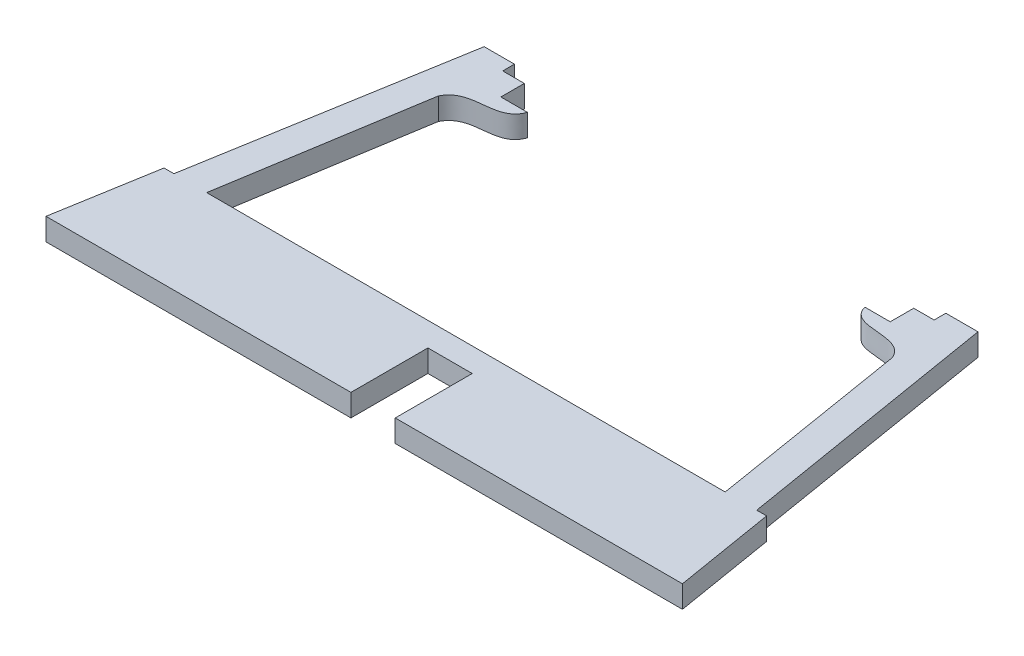
ISO-10303-21;
HEADER;
FILE_DESCRIPTION(('STEP AP214'),'2;1');
FILE_NAME('part.step','',(''),(''),'','','');
FILE_SCHEMA(('AUTOMOTIVE_DESIGN { 1 0 10303 214 1 1 1 1 }'));
ENDSEC;
DATA;
#1=APPLICATION_CONTEXT('core data for automotive mechanical design processes');
#2=APPLICATION_PROTOCOL_DEFINITION('international standard','automotive_design',2000,#1);
#3=PRODUCT_CONTEXT('',#1,'mechanical');
#4=PRODUCT('Part','Part','',(#3));
#5=PRODUCT_RELATED_PRODUCT_CATEGORY('part','',(#4));
#6=PRODUCT_DEFINITION_FORMATION('','',#4);
#7=PRODUCT_DEFINITION_CONTEXT('part definition',#1,'design');
#8=PRODUCT_DEFINITION('design','',#6,#7);
#9=PRODUCT_DEFINITION_SHAPE('','',#8);
#10=(LENGTH_UNIT() NAMED_UNIT(*) SI_UNIT(.MILLI.,.METRE.));
#11=(NAMED_UNIT(*) PLANE_ANGLE_UNIT() SI_UNIT($,.RADIAN.));
#12=(NAMED_UNIT(*) SI_UNIT($,.STERADIAN.) SOLID_ANGLE_UNIT());
#13=UNCERTAINTY_MEASURE_WITH_UNIT(LENGTH_MEASURE(1.E-05),#10,'distance_accuracy_value','');
#14=(GEOMETRIC_REPRESENTATION_CONTEXT(3) GLOBAL_UNCERTAINTY_ASSIGNED_CONTEXT((#13)) GLOBAL_UNIT_ASSIGNED_CONTEXT((#10,
#11,#12)) REPRESENTATION_CONTEXT('',''));
#15=CARTESIAN_POINT('',(0.,0.,0.));
#16=DIRECTION('',(0.,0.,1.));
#17=DIRECTION('',(1.,0.,0.));
#18=AXIS2_PLACEMENT_3D('',#15,#16,#17);
#19=CARTESIAN_POINT('',(-30.0315126073966,4.,11.2456540285645));
#20=CARTESIAN_POINT('',(-27.7782645048074,4.,6.8197638106394));
#21=CARTESIAN_POINT('',(-21.0741271297982,4.,10.3509374983913));
#22=CARTESIAN_POINT('',(-19.4282009021834,4.,5.77657746482289));
#23=B_SPLINE_CURVE_WITH_KNOTS('',3,(#19,#20,#21,#22),.UNSPECIFIED.,.F.,.F.,(4,4),(0.,1.),.UNSPECIFIED.);
#24=DIRECTION('',(0.,-1.,0.));
#25=VECTOR('',#24,1.);
#26=SURFACE_OF_LINEAR_EXTRUSION('',#23,#25);
#27=CARTESIAN_POINT('',(-30.0315126073966,0.,11.2456540285645));
#28=CARTESIAN_POINT('',(-27.7782645048074,0.,6.8197638106394));
#29=CARTESIAN_POINT('',(-21.0741271297982,0.,10.3509374983913));
#30=CARTESIAN_POINT('',(-19.4282009021834,0.,5.77657746482289));
#31=B_SPLINE_CURVE_WITH_KNOTS('',3,(#27,#28,#29,#30),.UNSPECIFIED.,.F.,.F.,(4,4),(0.,1.),.UNSPECIFIED.);
#32=CARTESIAN_POINT('',(-30.0315126073966,0.,11.2456540285645));
#33=VERTEX_POINT('',#32);
#34=CARTESIAN_POINT('',(-19.4282009021834,0.,5.77657746482289));
#35=VERTEX_POINT('',#34);
#36=EDGE_CURVE('E246',#33,#35,#31,.T.);
#37=ORIENTED_EDGE('',*,*,#36,.T.);
#38=DIRECTION('',(0.,-1.,0.));
#39=VECTOR('',#38,1.);
#40=CARTESIAN_POINT('',(-19.4282009021834,4.,5.77657746482289));
#41=LINE('',#40,#39);
#42=CARTESIAN_POINT('',(-19.4282009021834,4.,5.77657746482289));
#43=VERTEX_POINT('',#42);
#44=EDGE_CURVE('E11',#43,#35,#41,.T.);
#45=ORIENTED_EDGE('',*,*,#44,.F.);
#46=CARTESIAN_POINT('',(-30.0315126073966,4.,11.2456540285645));
#47=VERTEX_POINT('',#46);
#48=EDGE_CURVE('E306',#47,#43,#23,.T.);
#49=ORIENTED_EDGE('',*,*,#48,.F.);
#50=DIRECTION('',(0.,-1.,0.));
#51=VECTOR('',#50,1.);
#52=CARTESIAN_POINT('',(-30.0315126073966,4.,11.2456540285645));
#53=LINE('',#52,#51);
#54=EDGE_CURVE('E242',#47,#33,#53,.T.);
#55=ORIENTED_EDGE('',*,*,#54,.T.);
#56=EDGE_LOOP('',(#37,#45,#49,#55));
#57=FACE_BOUND('',#56,.T.);
#58=ADVANCED_FACE('F41',(#57),#26,.F.);
#59=CARTESIAN_POINT('',(-19.4282009021834,4.,5.77657746482289));
#60=DIRECTION('',(0.,0.,1.));
#61=DIRECTION('',(1.,0.,0.));
#62=AXIS2_PLACEMENT_3D('',#59,#60,#61);
#63=PLANE('',#62);
#64=DIRECTION('',(-1.,0.,0.));
#65=VECTOR('',#64,1.);
#66=CARTESIAN_POINT('',(-19.4282009021834,0.,5.77657746482289));
#67=LINE('',#66,#65);
#68=CARTESIAN_POINT('',(-24.2275946213852,0.,5.77657746482289));
#69=VERTEX_POINT('',#68);
#70=EDGE_CURVE('E251',#35,#69,#67,.T.);
#71=ORIENTED_EDGE('',*,*,#70,.T.);
#72=DIRECTION('',(0.,-1.,0.));
#73=VECTOR('',#72,1.);
#74=CARTESIAN_POINT('',(-24.2275946213852,4.,5.77657746482289));
#75=LINE('',#74,#73);
#76=CARTESIAN_POINT('',(-24.2275946213852,4.,5.77657746482289));
#77=VERTEX_POINT('',#76);
#78=EDGE_CURVE('E50',#77,#69,#75,.T.);
#79=ORIENTED_EDGE('',*,*,#78,.F.);
#80=DIRECTION('',(-1.,0.,0.));
#81=VECTOR('',#80,1.);
#82=CARTESIAN_POINT('',(-19.4282009021834,4.,5.77657746482289));
#83=LINE('',#82,#81);
#84=EDGE_CURVE('E155',#43,#77,#83,.T.);
#85=ORIENTED_EDGE('',*,*,#84,.F.);
#86=ORIENTED_EDGE('',*,*,#44,.T.);
#87=EDGE_LOOP('',(#71,#79,#85,#86));
#88=FACE_BOUND('',#87,.T.);
#89=ADVANCED_FACE('F516',(#88),#63,.F.);
#90=CARTESIAN_POINT('',(-24.2275946213852,4.,5.77657746482289));
#91=DIRECTION('',(-1.,0.,0.));
#92=DIRECTION('',(0.,0.,1.));
#93=AXIS2_PLACEMENT_3D('',#90,#91,#92);
#94=PLANE('',#93);
#95=DIRECTION('',(0.,0.,-1.));
#96=VECTOR('',#95,1.);
#97=CARTESIAN_POINT('',(-24.2275946213852,0.,5.77657746482289));
#98=LINE('',#97,#96);
#99=CARTESIAN_POINT('',(-24.2275946213852,0.,1.53525278273763));
#100=VERTEX_POINT('',#99);
#101=EDGE_CURVE('E256',#69,#100,#98,.T.);
#102=ORIENTED_EDGE('',*,*,#101,.T.);
#103=DIRECTION('',(0.,-1.,0.));
#104=VECTOR('',#103,1.);
#105=CARTESIAN_POINT('',(-24.2275946213852,4.,1.53525278273763));
#106=LINE('',#105,#104);
#107=CARTESIAN_POINT('',(-24.2275946213852,4.,1.53525278273763));
#108=VERTEX_POINT('',#107);
#109=EDGE_CURVE('E367',#108,#100,#106,.T.);
#110=ORIENTED_EDGE('',*,*,#109,.F.);
#111=DIRECTION('',(0.,0.,-1.));
#112=VECTOR('',#111,1.);
#113=CARTESIAN_POINT('',(-24.2275946213852,4.,5.77657746482289));
#114=LINE('',#113,#112);
#115=EDGE_CURVE('E375',#77,#108,#114,.T.);
#116=ORIENTED_EDGE('',*,*,#115,.F.);
#117=ORIENTED_EDGE('',*,*,#78,.T.);
#118=EDGE_LOOP('',(#102,#110,#116,#117));
#119=FACE_BOUND('',#118,.T.);
#120=ADVANCED_FACE('F373',(#119),#94,.F.);
#121=CARTESIAN_POINT('',(-24.2275946213852,4.,1.53525278273763));
#122=DIRECTION('',(0.,0.,1.));
#123=DIRECTION('',(1.,0.,0.));
#124=AXIS2_PLACEMENT_3D('',#121,#122,#123);
#125=PLANE('',#124);
#126=DIRECTION('',(-1.,0.,0.));
#127=VECTOR('',#126,1.);
#128=CARTESIAN_POINT('',(-24.2275946213852,0.,1.53525278273763));
#129=LINE('',#128,#127);
#130=CARTESIAN_POINT('',(-28.1340778812006,0.,1.53525278273763));
#131=VERTEX_POINT('',#130);
#132=EDGE_CURVE('E258',#100,#131,#129,.T.);
#133=ORIENTED_EDGE('',*,*,#132,.T.);
#134=DIRECTION('',(0.,-1.,0.));
#135=VECTOR('',#134,1.);
#136=CARTESIAN_POINT('',(-28.1340778812006,4.,1.53525278273763));
#137=LINE('',#136,#135);
#138=CARTESIAN_POINT('',(-28.1340778812006,4.,1.53525278273763));
#139=VERTEX_POINT('',#138);
#140=EDGE_CURVE('E364',#139,#131,#137,.T.);
#141=ORIENTED_EDGE('',*,*,#140,.F.);
#142=DIRECTION('',(-1.,0.,0.));
#143=VECTOR('',#142,1.);
#144=CARTESIAN_POINT('',(-24.2275946213852,4.,1.53525278273763));
#145=LINE('',#144,#143);
#146=EDGE_CURVE('E393',#108,#139,#145,.T.);
#147=ORIENTED_EDGE('',*,*,#146,.F.);
#148=ORIENTED_EDGE('',*,*,#109,.T.);
#149=EDGE_LOOP('',(#133,#141,#147,#148));
#150=FACE_BOUND('',#149,.T.);
#151=ADVANCED_FACE('F384',(#150),#125,.F.);
#152=CARTESIAN_POINT('',(-28.1340778812006,4.,1.53525278273763));
#153=DIRECTION('',(-1.,0.,0.));
#154=DIRECTION('',(0.,0.,1.));
#155=AXIS2_PLACEMENT_3D('',#152,#153,#154);
#156=PLANE('',#155);
#157=DIRECTION('',(0.,0.,-1.));
#158=VECTOR('',#157,1.);
#159=CARTESIAN_POINT('',(-28.1340778812006,0.,1.53525278273763));
#160=LINE('',#159,#158);
#161=CARTESIAN_POINT('',(-28.1340778812006,0.,-0.585409558305008));
#162=VERTEX_POINT('',#161);
#163=EDGE_CURVE('E260',#131,#162,#160,.T.);
#164=ORIENTED_EDGE('',*,*,#163,.T.);
#165=DIRECTION('',(0.,-1.,0.));
#166=VECTOR('',#165,1.);
#167=CARTESIAN_POINT('',(-28.1340778812006,4.,-0.585409558305008));
#168=LINE('',#167,#166);
#169=CARTESIAN_POINT('',(-28.1340778812006,4.,-0.585409558305008));
#170=VERTEX_POINT('',#169);
#171=EDGE_CURVE('E361',#170,#162,#168,.T.);
#172=ORIENTED_EDGE('',*,*,#171,.F.);
#173=DIRECTION('',(0.,0.,-1.));
#174=VECTOR('',#173,1.);
#175=CARTESIAN_POINT('',(-28.1340778812006,4.,1.53525278273763));
#176=LINE('',#175,#174);
#177=EDGE_CURVE('E390',#139,#170,#176,.T.);
#178=ORIENTED_EDGE('',*,*,#177,.F.);
#179=ORIENTED_EDGE('',*,*,#140,.T.);
#180=EDGE_LOOP('',(#164,#172,#178,#179));
#181=FACE_BOUND('',#180,.T.);
#182=ADVANCED_FACE('F388',(#181),#156,.F.);
#183=CARTESIAN_POINT('',(-28.1340778812006,4.,-0.585409558305008));
#184=DIRECTION('',(0.,0.,1.));
#185=DIRECTION('',(1.,0.,0.));
#186=AXIS2_PLACEMENT_3D('',#183,#184,#185);
#187=PLANE('',#186);
#188=DIRECTION('',(-1.,0.,0.));
#189=VECTOR('',#188,1.);
#190=CARTESIAN_POINT('',(-28.1340778812006,0.,-0.585409558305008));
#191=LINE('',#190,#189);
#192=CARTESIAN_POINT('',(-33.6031544449421,0.,-0.585409558305008));
#193=VERTEX_POINT('',#192);
#194=EDGE_CURVE('E262',#162,#193,#191,.T.);
#195=ORIENTED_EDGE('',*,*,#194,.T.);
#196=DIRECTION('',(0.,-1.,0.));
#197=VECTOR('',#196,1.);
#198=CARTESIAN_POINT('',(-33.6031544449421,4.,-0.585409558305008));
#199=LINE('',#198,#197);
#200=CARTESIAN_POINT('',(-33.6031544449421,4.,-0.585409558305008));
#201=VERTEX_POINT('',#200);
#202=EDGE_CURVE('E358',#201,#193,#199,.T.);
#203=ORIENTED_EDGE('',*,*,#202,.F.);
#204=DIRECTION('',(-1.,0.,0.));
#205=VECTOR('',#204,1.);
#206=CARTESIAN_POINT('',(-28.1340778812006,4.,-0.585409558305008));
#207=LINE('',#206,#205);
#208=EDGE_CURVE('E392',#170,#201,#207,.T.);
#209=ORIENTED_EDGE('',*,*,#208,.F.);
#210=ORIENTED_EDGE('',*,*,#171,.T.);
#211=EDGE_LOOP('',(#195,#203,#209,#210));
#212=FACE_BOUND('',#211,.T.);
#213=ADVANCED_FACE('F506',(#212),#187,.F.);
#214=CARTESIAN_POINT('',(-33.6031544449421,4.,-0.585409558305008));
#215=DIRECTION('',(0.985829256523882,0.,0.167751831529705));
#216=DIRECTION('',(0.167751831529705,0.,-0.985829256523882));
#217=AXIS2_PLACEMENT_3D('',#214,#215,#216);
#218=PLANE('',#217);
#219=DIRECTION('',(-0.167751831529705,0.,0.985829256523882));
#220=VECTOR('',#219,1.);
#221=CARTESIAN_POINT('',(-33.6031544449421,0.,-0.585409558305008));
#222=LINE('',#221,#220);
#223=CARTESIAN_POINT('',(-41.7509623868428,0.,47.2969138262892));
#224=VERTEX_POINT('',#223);
#225=EDGE_CURVE('E264',#193,#224,#222,.T.);
#226=ORIENTED_EDGE('',*,*,#225,.T.);
#227=DIRECTION('',(0.,-1.,0.));
#228=VECTOR('',#227,1.);
#229=CARTESIAN_POINT('',(-41.7509623868428,4.,47.2969138262892));
#230=LINE('',#229,#228);
#231=CARTESIAN_POINT('',(-41.7509623868428,4.,47.2969138262892));
#232=VERTEX_POINT('',#231);
#233=EDGE_CURVE('E355',#232,#224,#230,.T.);
#234=ORIENTED_EDGE('',*,*,#233,.F.);
#235=DIRECTION('',(-0.167751831529705,0.,0.985829256523882));
#236=VECTOR('',#235,1.);
#237=CARTESIAN_POINT('',(-33.6031544449421,4.,-0.585409558305008));
#238=LINE('',#237,#236);
#239=EDGE_CURVE('E395',#201,#232,#238,.T.);
#240=ORIENTED_EDGE('',*,*,#239,.F.);
#241=ORIENTED_EDGE('',*,*,#202,.T.);
#242=EDGE_LOOP('',(#226,#234,#240,#241));
#243=FACE_BOUND('',#242,.T.);
#244=ADVANCED_FACE('F502',(#243),#218,.F.);
#245=CARTESIAN_POINT('',(-41.7509623868428,4.,47.2969138262892));
#246=DIRECTION('',(0.,0.,1.));
#247=DIRECTION('',(1.,0.,0.));
#248=AXIS2_PLACEMENT_3D('',#245,#246,#247);
#249=PLANE('',#248);
#250=DIRECTION('',(-1.,0.,0.));
#251=VECTOR('',#250,1.);
#252=CARTESIAN_POINT('',(-41.7509623868428,0.,47.2969138262892));
#253=LINE('',#252,#251);
#254=CARTESIAN_POINT('',(-43.5367833056155,0.,47.2969138262892));
#255=VERTEX_POINT('',#254);
#256=EDGE_CURVE('E266',#224,#255,#253,.T.);
#257=ORIENTED_EDGE('',*,*,#256,.T.);
#258=DIRECTION('',(0.,-1.,0.));
#259=VECTOR('',#258,1.);
#260=CARTESIAN_POINT('',(-43.5367833056155,4.,47.2969138262892));
#261=LINE('',#260,#259);
#262=CARTESIAN_POINT('',(-43.5367833056155,4.,47.2969138262892));
#263=VERTEX_POINT('',#262);
#264=EDGE_CURVE('E352',#263,#255,#261,.T.);
#265=ORIENTED_EDGE('',*,*,#264,.F.);
#266=DIRECTION('',(-1.,0.,0.));
#267=VECTOR('',#266,1.);
#268=CARTESIAN_POINT('',(-41.7509623868428,4.,47.2969138262892));
#269=LINE('',#268,#267);
#270=EDGE_CURVE('E401',#232,#263,#269,.T.);
#271=ORIENTED_EDGE('',*,*,#270,.F.);
#272=ORIENTED_EDGE('',*,*,#233,.T.);
#273=EDGE_LOOP('',(#257,#265,#271,#272));
#274=FACE_BOUND('',#273,.T.);
#275=ADVANCED_FACE('F498',(#274),#249,.F.);
#276=CARTESIAN_POINT('',(-43.5367833056155,4.,47.2969138262892));
#277=DIRECTION('',(0.985829256523882,0.,0.167751831529705));
#278=DIRECTION('',(0.167751831529705,0.,-0.985829256523882));
#279=AXIS2_PLACEMENT_3D('',#276,#277,#278);
#280=PLANE('',#279);
#281=DIRECTION('',(-0.167751831529705,0.,0.985829256523882));
#282=VECTOR('',#281,1.);
#283=CARTESIAN_POINT('',(-43.5367833056155,0.,47.2969138262892));
#284=LINE('',#283,#282);
#285=CARTESIAN_POINT('',(-46.6361514478493,0.,65.5110087991427));
#286=VERTEX_POINT('',#285);
#287=EDGE_CURVE('E268',#255,#286,#284,.T.);
#288=ORIENTED_EDGE('',*,*,#287,.T.);
#289=DIRECTION('',(0.,-1.,0.));
#290=VECTOR('',#289,1.);
#291=CARTESIAN_POINT('',(-46.6361514478493,4.,65.5110087991427));
#292=LINE('',#291,#290);
#293=CARTESIAN_POINT('',(-46.6361514478493,4.,65.5110087991427));
#294=VERTEX_POINT('',#293);
#295=EDGE_CURVE('E349',#294,#286,#292,.T.);
#296=ORIENTED_EDGE('',*,*,#295,.F.);
#297=DIRECTION('',(-0.167751831529705,0.,0.985829256523882));
#298=VECTOR('',#297,1.);
#299=CARTESIAN_POINT('',(-43.5367833056155,4.,47.2969138262892));
#300=LINE('',#299,#298);
#301=EDGE_CURVE('E403',#263,#294,#300,.T.);
#302=ORIENTED_EDGE('',*,*,#301,.F.);
#303=ORIENTED_EDGE('',*,*,#264,.T.);
#304=EDGE_LOOP('',(#288,#296,#302,#303));
#305=FACE_BOUND('',#304,.T.);
#306=ADVANCED_FACE('F494',(#305),#280,.F.);
#307=CARTESIAN_POINT('',(-46.6361514478493,4.,65.5110087991427));
#308=DIRECTION('',(0.,0.,-1.));
#309=DIRECTION('',(-1.,0.,0.));
#310=AXIS2_PLACEMENT_3D('',#307,#308,#309);
#311=PLANE('',#310);
#312=DIRECTION('',(1.,0.,0.));
#313=VECTOR('',#312,1.);
#314=CARTESIAN_POINT('',(-46.6361514478493,0.,65.5110087991427));
#315=LINE('',#314,#313);
#316=CARTESIAN_POINT('',(8.43303086541918,0.,65.5110087991427));
#317=VERTEX_POINT('',#316);
#318=EDGE_CURVE('E270',#286,#317,#315,.T.);
#319=ORIENTED_EDGE('',*,*,#318,.T.);
#320=DIRECTION('',(0.,-1.,0.));
#321=VECTOR('',#320,1.);
#322=CARTESIAN_POINT('',(8.43303086541918,4.,65.5110087991427));
#323=LINE('',#322,#321);
#324=CARTESIAN_POINT('',(8.43303086541918,4.,65.5110087991427));
#325=VERTEX_POINT('',#324);
#326=EDGE_CURVE('E346',#325,#317,#323,.T.);
#327=ORIENTED_EDGE('',*,*,#326,.F.);
#328=DIRECTION('',(1.,0.,0.));
#329=VECTOR('',#328,1.);
#330=CARTESIAN_POINT('',(-46.6361514478493,4.,65.5110087991427));
#331=LINE('',#330,#329);
#332=EDGE_CURVE('E405',#294,#325,#331,.T.);
#333=ORIENTED_EDGE('',*,*,#332,.F.);
#334=ORIENTED_EDGE('',*,*,#295,.T.);
#335=EDGE_LOOP('',(#319,#327,#333,#334));
#336=FACE_BOUND('',#335,.T.);
#337=ADVANCED_FACE('F490',(#336),#311,.F.);
#338=CARTESIAN_POINT('',(8.43303086541918,4.,65.5110087991427));
#339=DIRECTION('',(-1.,0.,0.));
#340=DIRECTION('',(0.,0.,1.));
#341=AXIS2_PLACEMENT_3D('',#338,#339,#340);
#342=PLANE('',#341);
#343=DIRECTION('',(0.,0.,-1.));
#344=VECTOR('',#343,1.);
#345=CARTESIAN_POINT('',(8.43303086541918,0.,65.5110087991427));
#346=LINE('',#345,#344);
#347=CARTESIAN_POINT('',(8.43303086541918,0.,51.6110087991427));
#348=VERTEX_POINT('',#347);
#349=EDGE_CURVE('E272',#317,#348,#346,.T.);
#350=ORIENTED_EDGE('',*,*,#349,.T.);
#351=DIRECTION('',(0.,-1.,0.));
#352=VECTOR('',#351,1.);
#353=CARTESIAN_POINT('',(8.43303086541918,4.,51.6110087991427));
#354=LINE('',#353,#352);
#355=CARTESIAN_POINT('',(8.43303086541918,4.,51.6110087991427));
#356=VERTEX_POINT('',#355);
#357=EDGE_CURVE('E343',#356,#348,#354,.T.);
#358=ORIENTED_EDGE('',*,*,#357,.F.);
#359=DIRECTION('',(0.,0.,-1.));
#360=VECTOR('',#359,1.);
#361=CARTESIAN_POINT('',(8.43303086541918,4.,65.5110087991427));
#362=LINE('',#361,#360);
#363=EDGE_CURVE('E407',#325,#356,#362,.T.);
#364=ORIENTED_EDGE('',*,*,#363,.F.);
#365=ORIENTED_EDGE('',*,*,#326,.T.);
#366=EDGE_LOOP('',(#350,#358,#364,#365));
#367=FACE_BOUND('',#366,.T.);
#368=ADVANCED_FACE('F486',(#367),#342,.F.);
#369=CARTESIAN_POINT('',(8.43303086541918,4.,51.6110087991427));
#370=DIRECTION('',(0.,0.,-1.));
#371=DIRECTION('',(-1.,0.,0.));
#372=AXIS2_PLACEMENT_3D('',#369,#370,#371);
#373=PLANE('',#372);
#374=DIRECTION('',(1.,0.,0.));
#375=VECTOR('',#374,1.);
#376=CARTESIAN_POINT('',(8.43303086541918,0.,51.6110087991427));
#377=LINE('',#376,#375);
#378=CARTESIAN_POINT('',(16.4330308654192,0.,51.6110087991427));
#379=VERTEX_POINT('',#378);
#380=EDGE_CURVE('E274',#348,#379,#377,.T.);
#381=ORIENTED_EDGE('',*,*,#380,.T.);
#382=DIRECTION('',(0.,-1.,0.));
#383=VECTOR('',#382,1.);
#384=CARTESIAN_POINT('',(16.4330308654192,4.,51.6110087991427));
#385=LINE('',#384,#383);
#386=CARTESIAN_POINT('',(16.4330308654192,4.,51.6110087991427));
#387=VERTEX_POINT('',#386);
#388=EDGE_CURVE('E340',#387,#379,#385,.T.);
#389=ORIENTED_EDGE('',*,*,#388,.F.);
#390=DIRECTION('',(1.,0.,0.));
#391=VECTOR('',#390,1.);
#392=CARTESIAN_POINT('',(8.43303086541918,4.,51.6110087991427));
#393=LINE('',#392,#391);
#394=EDGE_CURVE('E409',#356,#387,#393,.T.);
#395=ORIENTED_EDGE('',*,*,#394,.F.);
#396=ORIENTED_EDGE('',*,*,#357,.T.);
#397=EDGE_LOOP('',(#381,#389,#395,#396));
#398=FACE_BOUND('',#397,.T.);
#399=ADVANCED_FACE('F482',(#398),#373,.F.);
#400=CARTESIAN_POINT('',(16.4330308654192,4.,51.6110087991427));
#401=DIRECTION('',(1.,0.,0.));
#402=DIRECTION('',(0.,0.,-1.));
#403=AXIS2_PLACEMENT_3D('',#400,#401,#402);
#404=PLANE('',#403);
#405=DIRECTION('',(0.,0.,1.));
#406=VECTOR('',#405,1.);
#407=CARTESIAN_POINT('',(16.4330308654192,0.,51.6110087991427));
#408=LINE('',#407,#406);
#409=CARTESIAN_POINT('',(16.4330308654192,0.,65.5110087991427));
#410=VERTEX_POINT('',#409);
#411=EDGE_CURVE('E276',#379,#410,#408,.T.);
#412=ORIENTED_EDGE('',*,*,#411,.T.);
#413=DIRECTION('',(0.,-1.,0.));
#414=VECTOR('',#413,1.);
#415=CARTESIAN_POINT('',(16.4330308654192,4.,65.5110087991427));
#416=LINE('',#415,#414);
#417=CARTESIAN_POINT('',(16.4330308654192,4.,65.5110087991427));
#418=VERTEX_POINT('',#417);
#419=EDGE_CURVE('E337',#418,#410,#416,.T.);
#420=ORIENTED_EDGE('',*,*,#419,.F.);
#421=DIRECTION('',(0.,0.,1.));
#422=VECTOR('',#421,1.);
#423=CARTESIAN_POINT('',(16.4330308654192,4.,51.6110087991427));
#424=LINE('',#423,#422);
#425=EDGE_CURVE('E411',#387,#418,#424,.T.);
#426=ORIENTED_EDGE('',*,*,#425,.F.);
#427=ORIENTED_EDGE('',*,*,#388,.T.);
#428=EDGE_LOOP('',(#412,#420,#426,#427));
#429=FACE_BOUND('',#428,.T.);
#430=ADVANCED_FACE('F478',(#429),#404,.F.);
#431=CARTESIAN_POINT('',(16.4330308654192,4.,65.5110087991427));
#432=DIRECTION('',(0.,0.,-1.));
#433=DIRECTION('',(-1.,0.,0.));
#434=AXIS2_PLACEMENT_3D('',#431,#432,#433);
#435=PLANE('',#434);
#436=DIRECTION('',(1.,0.,0.));
#437=VECTOR('',#436,1.);
#438=CARTESIAN_POINT('',(16.4330308654192,0.,65.5110087991427));
#439=LINE('',#438,#437);
#440=CARTESIAN_POINT('',(68.3002517325277,0.,65.5110087991427));
#441=VERTEX_POINT('',#440);
#442=EDGE_CURVE('E278',#410,#441,#439,.T.);
#443=ORIENTED_EDGE('',*,*,#442,.T.);
#444=DIRECTION('',(0.,-1.,0.));
#445=VECTOR('',#444,1.);
#446=CARTESIAN_POINT('',(68.3002517325277,4.,65.5110087991427));
#447=LINE('',#446,#445);
#448=CARTESIAN_POINT('',(68.3002517325277,4.,65.5110087991427));
#449=VERTEX_POINT('',#448);
#450=EDGE_CURVE('E334',#449,#441,#447,.T.);
#451=ORIENTED_EDGE('',*,*,#450,.F.);
#452=DIRECTION('',(1.,0.,0.));
#453=VECTOR('',#452,1.);
#454=CARTESIAN_POINT('',(16.4330308654192,4.,65.5110087991427));
#455=LINE('',#454,#453);
#456=EDGE_CURVE('E413',#418,#449,#455,.T.);
#457=ORIENTED_EDGE('',*,*,#456,.F.);
#458=ORIENTED_EDGE('',*,*,#419,.T.);
#459=EDGE_LOOP('',(#443,#451,#457,#458));
#460=FACE_BOUND('',#459,.T.);
#461=ADVANCED_FACE('F474',(#460),#435,.F.);
#462=CARTESIAN_POINT('',(68.3002517325277,4.,65.5110087991427));
#463=DIRECTION('',(-0.986587440523844,0.,0.163233642980274));
#464=DIRECTION('',(0.163233642980274,0.,0.986587440523844));
#465=AXIS2_PLACEMENT_3D('',#462,#463,#464);
#466=PLANE('',#465);
#467=DIRECTION('',(-0.163233642980274,0.,-0.986587440523843));
#468=VECTOR('',#467,1.);
#469=CARTESIAN_POINT('',(68.3002517325277,0.,65.5110087991427));
#470=LINE('',#469,#468);
#471=CARTESIAN_POINT('',(65.2866789320987,0.,47.2969138262892));
#472=VERTEX_POINT('',#471);
#473=EDGE_CURVE('E280',#441,#472,#470,.T.);
#474=ORIENTED_EDGE('',*,*,#473,.T.);
#475=DIRECTION('',(0.,-1.,0.));
#476=VECTOR('',#475,1.);
#477=CARTESIAN_POINT('',(65.2866789320987,4.,47.2969138262892));
#478=LINE('',#477,#476);
#479=CARTESIAN_POINT('',(65.2866789320987,4.,47.2969138262892));
#480=VERTEX_POINT('',#479);
#481=EDGE_CURVE('E331',#480,#472,#478,.T.);
#482=ORIENTED_EDGE('',*,*,#481,.F.);
#483=DIRECTION('',(-0.163233642980274,0.,-0.986587440523843));
#484=VECTOR('',#483,1.);
#485=CARTESIAN_POINT('',(68.3002517325277,4.,65.5110087991427));
#486=LINE('',#485,#484);
#487=EDGE_CURVE('E415',#449,#480,#486,.T.);
#488=ORIENTED_EDGE('',*,*,#487,.F.);
#489=ORIENTED_EDGE('',*,*,#450,.T.);
#490=EDGE_LOOP('',(#474,#482,#488,#489));
#491=FACE_BOUND('',#490,.T.);
#492=ADVANCED_FACE('F470',(#491),#466,.F.);
#493=CARTESIAN_POINT('',(65.2866789320987,4.,47.2969138262892));
#494=DIRECTION('',(0.,0.,1.));
#495=DIRECTION('',(1.,0.,0.));
#496=AXIS2_PLACEMENT_3D('',#493,#494,#495);
#497=PLANE('',#496);
#498=DIRECTION('',(-1.,0.,0.));
#499=VECTOR('',#498,1.);
#500=CARTESIAN_POINT('',(65.2866789320987,0.,47.2969138262892));
#501=LINE('',#500,#499);
#502=CARTESIAN_POINT('',(63.500858013326,0.,47.2969138262892));
#503=VERTEX_POINT('',#502);
#504=EDGE_CURVE('E282',#472,#503,#501,.T.);
#505=ORIENTED_EDGE('',*,*,#504,.T.);
#506=DIRECTION('',(0.,-1.,0.));
#507=VECTOR('',#506,1.);
#508=CARTESIAN_POINT('',(63.500858013326,4.,47.2969138262892));
#509=LINE('',#508,#507);
#510=CARTESIAN_POINT('',(63.500858013326,4.,47.2969138262892));
#511=VERTEX_POINT('',#510);
#512=EDGE_CURVE('E328',#511,#503,#509,.T.);
#513=ORIENTED_EDGE('',*,*,#512,.F.);
#514=DIRECTION('',(-1.,0.,0.));
#515=VECTOR('',#514,1.);
#516=CARTESIAN_POINT('',(65.2866789320987,4.,47.2969138262892));
#517=LINE('',#516,#515);
#518=EDGE_CURVE('E417',#480,#511,#517,.T.);
#519=ORIENTED_EDGE('',*,*,#518,.F.);
#520=ORIENTED_EDGE('',*,*,#481,.T.);
#521=EDGE_LOOP('',(#505,#513,#519,#520));
#522=FACE_BOUND('',#521,.T.);
#523=ADVANCED_FACE('F466',(#522),#497,.F.);
#524=CARTESIAN_POINT('',(63.500858013326,4.,47.2969138262892));
#525=DIRECTION('',(-0.986587440523843,0.,0.163233642980275));
#526=DIRECTION('',(0.163233642980275,0.,0.986587440523844));
#527=AXIS2_PLACEMENT_3D('',#524,#525,#526);
#528=PLANE('',#527);
#529=DIRECTION('',(-0.163233642980275,0.,-0.986587440523843));
#530=VECTOR('',#529,1.);
#531=CARTESIAN_POINT('',(63.500858013326,0.,47.2969138262892));
#532=LINE('',#531,#530);
#533=CARTESIAN_POINT('',(55.5785940969346,0.,-0.585409558305008));
#534=VERTEX_POINT('',#533);
#535=EDGE_CURVE('E284',#503,#534,#532,.T.);
#536=ORIENTED_EDGE('',*,*,#535,.T.);
#537=DIRECTION('',(0.,-1.,0.));
#538=VECTOR('',#537,1.);
#539=CARTESIAN_POINT('',(55.5785940969346,4.,-0.585409558305008));
#540=LINE('',#539,#538);
#541=CARTESIAN_POINT('',(55.5785940969346,4.,-0.585409558305008));
#542=VERTEX_POINT('',#541);
#543=EDGE_CURVE('E325',#542,#534,#540,.T.);
#544=ORIENTED_EDGE('',*,*,#543,.F.);
#545=DIRECTION('',(-0.163233642980275,0.,-0.986587440523843));
#546=VECTOR('',#545,1.);
#547=CARTESIAN_POINT('',(63.500858013326,4.,47.2969138262892));
#548=LINE('',#547,#546);
#549=EDGE_CURVE('E419',#511,#542,#548,.T.);
#550=ORIENTED_EDGE('',*,*,#549,.F.);
#551=ORIENTED_EDGE('',*,*,#512,.T.);
#552=EDGE_LOOP('',(#536,#544,#550,#551));
#553=FACE_BOUND('',#552,.T.);
#554=ADVANCED_FACE('F462',(#553),#528,.F.);
#555=CARTESIAN_POINT('',(55.5785940969346,4.,-0.585409558305008));
#556=DIRECTION('',(0.,0.,1.));
#557=DIRECTION('',(1.,0.,0.));
#558=AXIS2_PLACEMENT_3D('',#555,#556,#557);
#559=PLANE('',#558);
#560=DIRECTION('',(-1.,0.,0.));
#561=VECTOR('',#560,1.);
#562=CARTESIAN_POINT('',(55.5785940969346,0.,-0.585409558305008));
#563=LINE('',#562,#561);
#564=CARTESIAN_POINT('',(49.7723597002604,0.,-0.585409558305008));
#565=VERTEX_POINT('',#564);
#566=EDGE_CURVE('E286',#534,#565,#563,.T.);
#567=ORIENTED_EDGE('',*,*,#566,.T.);
#568=DIRECTION('',(0.,-1.,0.));
#569=VECTOR('',#568,1.);
#570=CARTESIAN_POINT('',(49.7723597002604,4.,-0.585409558305008));
#571=LINE('',#570,#569);
#572=CARTESIAN_POINT('',(49.7723597002604,4.,-0.585409558305008));
#573=VERTEX_POINT('',#572);
#574=EDGE_CURVE('E322',#573,#565,#571,.T.);
#575=ORIENTED_EDGE('',*,*,#574,.F.);
#576=DIRECTION('',(-1.,0.,0.));
#577=VECTOR('',#576,1.);
#578=CARTESIAN_POINT('',(55.5785940969346,4.,-0.585409558305008));
#579=LINE('',#578,#577);
#580=EDGE_CURVE('E421',#542,#573,#579,.T.);
#581=ORIENTED_EDGE('',*,*,#580,.F.);
#582=ORIENTED_EDGE('',*,*,#543,.T.);
#583=EDGE_LOOP('',(#567,#575,#581,#582));
#584=FACE_BOUND('',#583,.T.);
#585=ADVANCED_FACE('F458',(#584),#559,.F.);
#586=CARTESIAN_POINT('',(49.7723597002604,4.,-0.585409558305008));
#587=DIRECTION('',(1.,0.,0.));
#588=DIRECTION('',(0.,0.,-1.));
#589=AXIS2_PLACEMENT_3D('',#586,#587,#588);
#590=PLANE('',#589);
#591=DIRECTION('',(0.,0.,1.));
#592=VECTOR('',#591,1.);
#593=CARTESIAN_POINT('',(49.7723597002604,0.,-0.585409558305008));
#594=LINE('',#593,#592);
#595=CARTESIAN_POINT('',(49.7723597002604,0.,1.53525278273763));
#596=VERTEX_POINT('',#595);
#597=EDGE_CURVE('E288',#565,#596,#594,.T.);
#598=ORIENTED_EDGE('',*,*,#597,.T.);
#599=DIRECTION('',(0.,-1.,0.));
#600=VECTOR('',#599,1.);
#601=CARTESIAN_POINT('',(49.7723597002604,4.,1.53525278273763));
#602=LINE('',#601,#600);
#603=CARTESIAN_POINT('',(49.7723597002604,4.,1.53525278273763));
#604=VERTEX_POINT('',#603);
#605=EDGE_CURVE('E319',#604,#596,#602,.T.);
#606=ORIENTED_EDGE('',*,*,#605,.F.);
#607=DIRECTION('',(0.,0.,1.));
#608=VECTOR('',#607,1.);
#609=CARTESIAN_POINT('',(49.7723597002604,4.,-0.585409558305008));
#610=LINE('',#609,#608);
#611=EDGE_CURVE('E423',#573,#604,#610,.T.);
#612=ORIENTED_EDGE('',*,*,#611,.F.);
#613=ORIENTED_EDGE('',*,*,#574,.T.);
#614=EDGE_LOOP('',(#598,#606,#612,#613));
#615=FACE_BOUND('',#614,.T.);
#616=ADVANCED_FACE('F454',(#615),#590,.F.);
#617=CARTESIAN_POINT('',(49.7723597002604,4.,1.53525278273763));
#618=DIRECTION('',(0.,0.,1.));
#619=DIRECTION('',(1.,0.,0.));
#620=AXIS2_PLACEMENT_3D('',#617,#618,#619);
#621=PLANE('',#620);
#622=DIRECTION('',(-1.,0.,0.));
#623=VECTOR('',#622,1.);
#624=CARTESIAN_POINT('',(49.7723597002604,0.,1.53525278273763));
#625=LINE('',#624,#623);
#626=CARTESIAN_POINT('',(46.0891040552917,0.,1.53525278273763));
#627=VERTEX_POINT('',#626);
#628=EDGE_CURVE('E290',#596,#627,#625,.T.);
#629=ORIENTED_EDGE('',*,*,#628,.T.);
#630=DIRECTION('',(0.,-1.,0.));
#631=VECTOR('',#630,1.);
#632=CARTESIAN_POINT('',(46.0891040552917,4.,1.53525278273763));
#633=LINE('',#632,#631);
#634=CARTESIAN_POINT('',(46.0891040552917,4.,1.53525278273763));
#635=VERTEX_POINT('',#634);
#636=EDGE_CURVE('E316',#635,#627,#633,.T.);
#637=ORIENTED_EDGE('',*,*,#636,.F.);
#638=DIRECTION('',(-1.,0.,0.));
#639=VECTOR('',#638,1.);
#640=CARTESIAN_POINT('',(49.7723597002604,4.,1.53525278273763));
#641=LINE('',#640,#639);
#642=EDGE_CURVE('E425',#604,#635,#641,.T.);
#643=ORIENTED_EDGE('',*,*,#642,.F.);
#644=ORIENTED_EDGE('',*,*,#605,.T.);
#645=EDGE_LOOP('',(#629,#637,#643,#644));
#646=FACE_BOUND('',#645,.T.);
#647=ADVANCED_FACE('F450',(#646),#621,.F.);
#648=CARTESIAN_POINT('',(46.0891040552917,4.,1.53525278273763));
#649=DIRECTION('',(1.,0.,0.));
#650=DIRECTION('',(0.,0.,-1.));
#651=AXIS2_PLACEMENT_3D('',#648,#649,#650);
#652=PLANE('',#651);
#653=DIRECTION('',(0.,0.,1.));
#654=VECTOR('',#653,1.);
#655=CARTESIAN_POINT('',(46.0891040552917,0.,1.53525278273763));
#656=LINE('',#655,#654);
#657=CARTESIAN_POINT('',(46.0891040552917,0.,5.77657746482289));
#658=VERTEX_POINT('',#657);
#659=EDGE_CURVE('E292',#627,#658,#656,.T.);
#660=ORIENTED_EDGE('',*,*,#659,.T.);
#661=DIRECTION('',(0.,-1.,0.));
#662=VECTOR('',#661,1.);
#663=CARTESIAN_POINT('',(46.0891040552917,4.,5.77657746482289));
#664=LINE('',#663,#662);
#665=CARTESIAN_POINT('',(46.0891040552917,4.,5.77657746482289));
#666=VERTEX_POINT('',#665);
#667=EDGE_CURVE('E313',#666,#658,#664,.T.);
#668=ORIENTED_EDGE('',*,*,#667,.F.);
#669=DIRECTION('',(0.,0.,1.));
#670=VECTOR('',#669,1.);
#671=CARTESIAN_POINT('',(46.0891040552917,4.,1.53525278273763));
#672=LINE('',#671,#670);
#673=EDGE_CURVE('E427',#635,#666,#672,.T.);
#674=ORIENTED_EDGE('',*,*,#673,.F.);
#675=ORIENTED_EDGE('',*,*,#636,.T.);
#676=EDGE_LOOP('',(#660,#668,#674,#675));
#677=FACE_BOUND('',#676,.T.);
#678=ADVANCED_FACE('F446',(#677),#652,.F.);
#679=CARTESIAN_POINT('',(46.0891040552917,4.,5.77657746482289));
#680=DIRECTION('',(0.,0.,1.));
#681=DIRECTION('',(1.,0.,0.));
#682=AXIS2_PLACEMENT_3D('',#679,#680,#681);
#683=PLANE('',#682);
#684=DIRECTION('',(-1.,0.,0.));
#685=VECTOR('',#684,1.);
#686=CARTESIAN_POINT('',(46.0891040552917,0.,5.77657746482289));
#687=LINE('',#686,#685);
#688=CARTESIAN_POINT('',(41.5129379509365,0.,5.77657746482289));
#689=VERTEX_POINT('',#688);
#690=EDGE_CURVE('E294',#658,#689,#687,.T.);
#691=ORIENTED_EDGE('',*,*,#690,.T.);
#692=DIRECTION('',(0.,-1.,0.));
#693=VECTOR('',#692,1.);
#694=CARTESIAN_POINT('',(41.5129379509365,4.,5.77657746482289));
#695=LINE('',#694,#693);
#696=CARTESIAN_POINT('',(41.5129379509365,4.,5.77657746482289));
#697=VERTEX_POINT('',#696);
#698=EDGE_CURVE('E310',#697,#689,#695,.T.);
#699=ORIENTED_EDGE('',*,*,#698,.F.);
#700=DIRECTION('',(-1.,0.,0.));
#701=VECTOR('',#700,1.);
#702=CARTESIAN_POINT('',(46.0891040552917,4.,5.77657746482289));
#703=LINE('',#702,#701);
#704=EDGE_CURVE('E429',#666,#697,#703,.T.);
#705=ORIENTED_EDGE('',*,*,#704,.F.);
#706=ORIENTED_EDGE('',*,*,#667,.T.);
#707=EDGE_LOOP('',(#691,#699,#705,#706));
#708=FACE_BOUND('',#707,.T.);
#709=ADVANCED_FACE('F441',(#708),#683,.F.);
#710=CARTESIAN_POINT('',(41.5129379509365,4.,5.77657746482289));
#711=CARTESIAN_POINT('',(42.6953351198308,4.,10.4105628990638));
#712=CARTESIAN_POINT('',(50.0172679095962,4.,6.58205806725895));
#713=CARTESIAN_POINT('',(51.8930220413031,4.,11.2456540285645));
#714=B_SPLINE_CURVE_WITH_KNOTS('',3,(#710,#711,#712,#713),.UNSPECIFIED.,.F.,.F.,(4,4),(0.,1.),.UNSPECIFIED.);
#715=DIRECTION('',(0.,-1.,0.));
#716=VECTOR('',#715,1.);
#717=SURFACE_OF_LINEAR_EXTRUSION('',#714,#716);
#718=CARTESIAN_POINT('',(41.5129379509365,0.,5.77657746482289));
#719=CARTESIAN_POINT('',(42.6953351198308,0.,10.4105628990638));
#720=CARTESIAN_POINT('',(50.0172679095962,0.,6.58205806725895));
#721=CARTESIAN_POINT('',(51.8930220413031,0.,11.2456540285645));
#722=B_SPLINE_CURVE_WITH_KNOTS('',3,(#718,#719,#720,#721),.UNSPECIFIED.,.F.,.F.,(4,4),(0.,1.),.UNSPECIFIED.);
#723=CARTESIAN_POINT('',(51.8930220413031,0.,11.2456540285645));
#724=VERTEX_POINT('',#723);
#725=EDGE_CURVE('E296',#689,#724,#722,.T.);
#726=ORIENTED_EDGE('',*,*,#725,.T.);
#727=DIRECTION('',(0.,-1.,0.));
#728=VECTOR('',#727,1.);
#729=CARTESIAN_POINT('',(51.8930220413031,4.,11.2456540285645));
#730=LINE('',#729,#728);
#731=CARTESIAN_POINT('',(51.8930220413031,4.,11.2456540285645));
#732=VERTEX_POINT('',#731);
#733=EDGE_CURVE('E237',#732,#724,#730,.T.);
#734=ORIENTED_EDGE('',*,*,#733,.F.);
#735=EDGE_CURVE('E228',#697,#732,#714,.T.);
#736=ORIENTED_EDGE('',*,*,#735,.F.);
#737=ORIENTED_EDGE('',*,*,#698,.T.);
#738=EDGE_LOOP('',(#726,#734,#736,#737));
#739=FACE_BOUND('',#738,.T.);
#740=ADVANCED_FACE('F437',(#739),#717,.F.);
#741=CARTESIAN_POINT('',(57.8085538347378,4.,47.2969138262892));
#742=DIRECTION('',(0.986803667450458,0.,-0.161921344813853));
#743=DIRECTION('',(-0.161921344813853,0.,-0.986803667450458));
#744=AXIS2_PLACEMENT_3D('',#741,#742,#743);
#745=PLANE('',#744);
#746=DIRECTION('',(0.161921344813853,0.,0.986803667450458));
#747=VECTOR('',#746,1.);
#748=CARTESIAN_POINT('',(57.8085538347378,0.,47.2969138262892));
#749=LINE('',#748,#747);
#750=CARTESIAN_POINT('',(57.8085538347378,0.,47.2969138262892));
#751=VERTEX_POINT('',#750);
#752=EDGE_CURVE('E236',#724,#751,#749,.T.);
#753=ORIENTED_EDGE('',*,*,#752,.T.);
#754=DIRECTION('',(0.,-1.,0.));
#755=VECTOR('',#754,1.);
#756=CARTESIAN_POINT('',(57.8085538347378,4.,47.2969138262892));
#757=LINE('',#756,#755);
#758=CARTESIAN_POINT('',(57.8085538347378,4.,47.2969138262892));
#759=VERTEX_POINT('',#758);
#760=EDGE_CURVE('E233',#759,#751,#757,.T.);
#761=ORIENTED_EDGE('',*,*,#760,.F.);
#762=DIRECTION('',(0.161921344813853,0.,0.986803667450458));
#763=VECTOR('',#762,1.);
#764=CARTESIAN_POINT('',(57.8085538347378,4.,47.2969138262892));
#765=LINE('',#764,#763);
#766=EDGE_CURVE('E222',#732,#759,#765,.T.);
#767=ORIENTED_EDGE('',*,*,#766,.F.);
#768=ORIENTED_EDGE('',*,*,#733,.T.);
#769=EDGE_LOOP('',(#753,#761,#767,#768));
#770=FACE_BOUND('',#769,.T.);
#771=ADVANCED_FACE('F234',(#770),#745,.F.);
#772=CARTESIAN_POINT('',(-35.835430593408,4.,47.2969138262892));
#773=DIRECTION('',(0.,0.,1.));
#774=DIRECTION('',(1.,0.,0.));
#775=AXIS2_PLACEMENT_3D('',#772,#773,#774);
#776=PLANE('',#775);
#777=DIRECTION('',(-1.,0.,0.));
#778=VECTOR('',#777,1.);
#779=CARTESIAN_POINT('',(-35.835430593408,0.,47.2969138262892));
#780=LINE('',#779,#778);
#781=CARTESIAN_POINT('',(-35.835430593408,0.,47.2969138262892));
#782=VERTEX_POINT('',#781);
#783=EDGE_CURVE('E141',#751,#782,#780,.T.);
#784=ORIENTED_EDGE('',*,*,#783,.T.);
#785=DIRECTION('',(0.,-1.,0.));
#786=VECTOR('',#785,1.);
#787=CARTESIAN_POINT('',(-35.835430593408,4.,47.2969138262892));
#788=LINE('',#787,#786);
#789=CARTESIAN_POINT('',(-35.835430593408,4.,47.2969138262892));
#790=VERTEX_POINT('',#789);
#791=EDGE_CURVE('E238',#790,#782,#788,.T.);
#792=ORIENTED_EDGE('',*,*,#791,.F.);
#793=DIRECTION('',(-1.,0.,0.));
#794=VECTOR('',#793,1.);
#795=CARTESIAN_POINT('',(-35.835430593408,4.,47.2969138262892));
#796=LINE('',#795,#794);
#797=EDGE_CURVE('E226',#759,#790,#796,.T.);
#798=ORIENTED_EDGE('',*,*,#797,.F.);
#799=ORIENTED_EDGE('',*,*,#760,.T.);
#800=EDGE_LOOP('',(#784,#792,#798,#799));
#801=FACE_BOUND('',#800,.T.);
#802=ADVANCED_FACE('F240',(#801),#776,.F.);
#803=CARTESIAN_POINT('',(-30.0315126073966,4.,11.2456540285645));
#804=DIRECTION('',(-0.987287578888797,0.,-0.158944130347422));
#805=DIRECTION('',(-0.158944130347422,0.,0.987287578888797));
#806=AXIS2_PLACEMENT_3D('',#803,#804,#805);
#807=PLANE('',#806);
#808=DIRECTION('',(0.158944130347422,0.,-0.987287578888797));
#809=VECTOR('',#808,1.);
#810=CARTESIAN_POINT('',(-30.0315126073966,0.,11.2456540285645));
#811=LINE('',#810,#809);
#812=EDGE_CURVE('E147',#782,#33,#811,.T.);
#813=ORIENTED_EDGE('',*,*,#812,.T.);
#814=ORIENTED_EDGE('',*,*,#54,.F.);
#815=DIRECTION('',(0.158944130347422,0.,-0.987287578888797));
#816=VECTOR('',#815,1.);
#817=CARTESIAN_POINT('',(-30.0315126073966,4.,11.2456540285645));
#818=LINE('',#817,#816);
#819=EDGE_CURVE('E58',#790,#47,#818,.T.);
#820=ORIENTED_EDGE('',*,*,#819,.F.);
#821=ORIENTED_EDGE('',*,*,#791,.T.);
#822=EDGE_LOOP('',(#813,#814,#820,#821));
#823=FACE_BOUND('',#822,.T.);
#824=ADVANCED_FACE('F574',(#823),#807,.F.);
#825=CARTESIAN_POINT('',(-24.5021110516746,4.,8.56679192755991));
#826=DIRECTION('',(0.,1.,0.));
#827=DIRECTION('',(0.,0.,1.));
#828=AXIS2_PLACEMENT_3D('',#825,#826,#827);
#829=PLANE('',#828);
#830=ORIENTED_EDGE('',*,*,#48,.T.);
#831=ORIENTED_EDGE('',*,*,#84,.T.);
#832=ORIENTED_EDGE('',*,*,#115,.T.);
#833=ORIENTED_EDGE('',*,*,#146,.T.);
#834=ORIENTED_EDGE('',*,*,#177,.T.);
#835=ORIENTED_EDGE('',*,*,#208,.T.);
#836=ORIENTED_EDGE('',*,*,#239,.T.);
#837=ORIENTED_EDGE('',*,*,#270,.T.);
#838=ORIENTED_EDGE('',*,*,#301,.T.);
#839=ORIENTED_EDGE('',*,*,#332,.T.);
#840=ORIENTED_EDGE('',*,*,#363,.T.);
#841=ORIENTED_EDGE('',*,*,#394,.T.);
#842=ORIENTED_EDGE('',*,*,#425,.T.);
#843=ORIENTED_EDGE('',*,*,#456,.T.);
#844=ORIENTED_EDGE('',*,*,#487,.T.);
#845=ORIENTED_EDGE('',*,*,#518,.T.);
#846=ORIENTED_EDGE('',*,*,#549,.T.);
#847=ORIENTED_EDGE('',*,*,#580,.T.);
#848=ORIENTED_EDGE('',*,*,#611,.T.);
#849=ORIENTED_EDGE('',*,*,#642,.T.);
#850=ORIENTED_EDGE('',*,*,#673,.T.);
#851=ORIENTED_EDGE('',*,*,#704,.T.);
#852=ORIENTED_EDGE('',*,*,#735,.T.);
#853=ORIENTED_EDGE('',*,*,#766,.T.);
#854=ORIENTED_EDGE('',*,*,#797,.T.);
#855=ORIENTED_EDGE('',*,*,#819,.T.);
#856=EDGE_LOOP('',(#830,#831,#832,#833,#834,#835,#836,#837,#838,#839,#840,#841,#842,#843,#844,
#845,#846,#847,#848,#849,#850,#851,#852,#853,#854,#855));
#857=FACE_BOUND('',#856,.T.);
#858=ADVANCED_FACE('F224',(#857),#829,.T.);
#859=CARTESIAN_POINT('',(-24.5021110516746,0.,8.56679192755991));
#860=DIRECTION('',(0.,1.,0.));
#861=DIRECTION('',(0.,0.,1.));
#862=AXIS2_PLACEMENT_3D('',#859,#860,#861);
#863=PLANE('',#862);
#864=ORIENTED_EDGE('',*,*,#36,.F.);
#865=ORIENTED_EDGE('',*,*,#812,.F.);
#866=ORIENTED_EDGE('',*,*,#783,.F.);
#867=ORIENTED_EDGE('',*,*,#752,.F.);
#868=ORIENTED_EDGE('',*,*,#725,.F.);
#869=ORIENTED_EDGE('',*,*,#690,.F.);
#870=ORIENTED_EDGE('',*,*,#659,.F.);
#871=ORIENTED_EDGE('',*,*,#628,.F.);
#872=ORIENTED_EDGE('',*,*,#597,.F.);
#873=ORIENTED_EDGE('',*,*,#566,.F.);
#874=ORIENTED_EDGE('',*,*,#535,.F.);
#875=ORIENTED_EDGE('',*,*,#504,.F.);
#876=ORIENTED_EDGE('',*,*,#473,.F.);
#877=ORIENTED_EDGE('',*,*,#442,.F.);
#878=ORIENTED_EDGE('',*,*,#411,.F.);
#879=ORIENTED_EDGE('',*,*,#380,.F.);
#880=ORIENTED_EDGE('',*,*,#349,.F.);
#881=ORIENTED_EDGE('',*,*,#318,.F.);
#882=ORIENTED_EDGE('',*,*,#287,.F.);
#883=ORIENTED_EDGE('',*,*,#256,.F.);
#884=ORIENTED_EDGE('',*,*,#225,.F.);
#885=ORIENTED_EDGE('',*,*,#194,.F.);
#886=ORIENTED_EDGE('',*,*,#163,.F.);
#887=ORIENTED_EDGE('',*,*,#132,.F.);
#888=ORIENTED_EDGE('',*,*,#101,.F.);
#889=ORIENTED_EDGE('',*,*,#70,.F.);
#890=EDGE_LOOP('',(#864,#865,#866,#867,#868,#869,#870,#871,#872,#873,#874,#875,#876,#877,#878,
#879,#880,#881,#882,#883,#884,#885,#886,#887,#888,#889));
#891=FACE_BOUND('',#890,.T.);
#892=ADVANCED_FACE('F379',(#891),#863,.F.);
#893=CLOSED_SHELL('',(#58,#89,#120,#151,#182,#213,#244,#275,#306,#337,#368,#399,#430,#461,#492,
#523,#554,#585,#616,#647,#678,#709,#740,#771,#802,#824,#858,#892));
#894=MANIFOLD_SOLID_BREP('B2',#893);
#895=ADVANCED_BREP_SHAPE_REPRESENTATION('',(#18,#894),#14);
#896=SHAPE_DEFINITION_REPRESENTATION(#9,#895);
ENDSEC;
END-ISO-10303-21;
